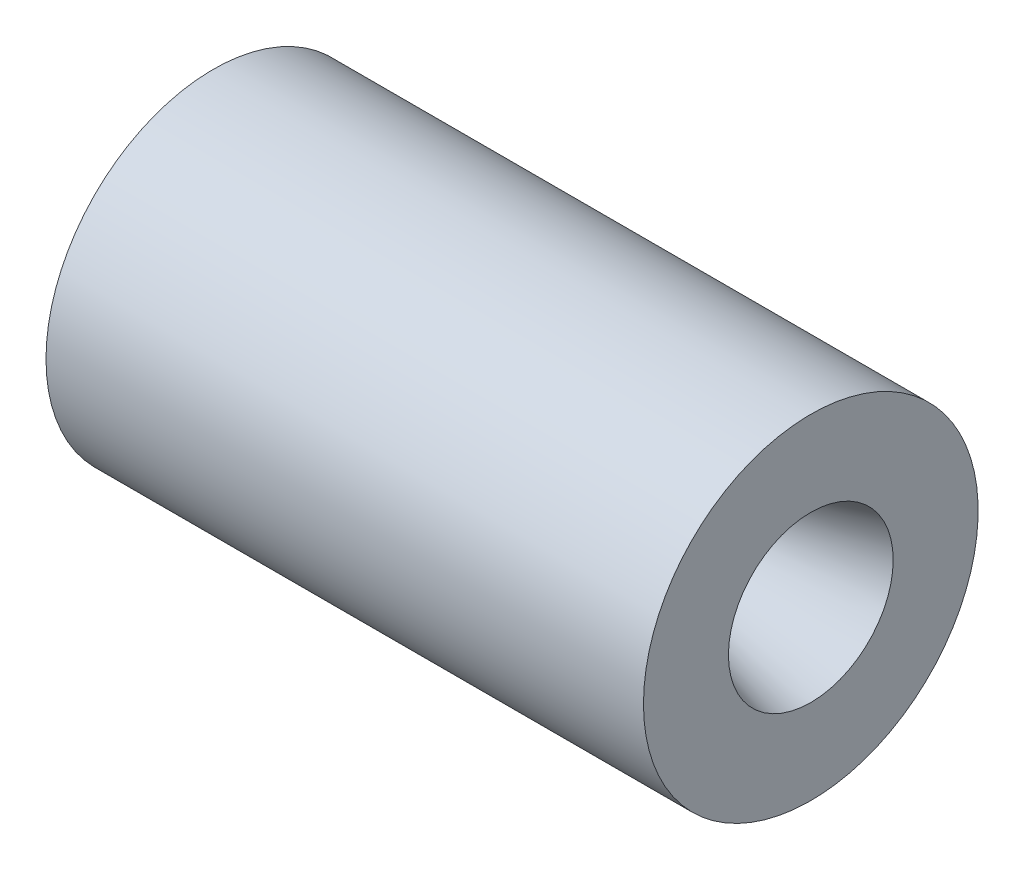
ISO-10303-21;
HEADER;
FILE_DESCRIPTION(('STEP AP214'),'2;1');
FILE_NAME('part.step','',(''),(''),'','','');
FILE_SCHEMA(('AUTOMOTIVE_DESIGN { 1 0 10303 214 1 1 1 1 }'));
ENDSEC;
DATA;
#1=APPLICATION_CONTEXT('core data for automotive mechanical design processes');
#2=APPLICATION_PROTOCOL_DEFINITION('international standard','automotive_design',2000,#1);
#3=PRODUCT_CONTEXT('',#1,'mechanical');
#4=PRODUCT('Part','Part','',(#3));
#5=PRODUCT_RELATED_PRODUCT_CATEGORY('part','',(#4));
#6=PRODUCT_DEFINITION_FORMATION('','',#4);
#7=PRODUCT_DEFINITION_CONTEXT('part definition',#1,'design');
#8=PRODUCT_DEFINITION('design','',#6,#7);
#9=PRODUCT_DEFINITION_SHAPE('','',#8);
#10=(LENGTH_UNIT() NAMED_UNIT(*) SI_UNIT(.MILLI.,.METRE.));
#11=(NAMED_UNIT(*) PLANE_ANGLE_UNIT() SI_UNIT($,.RADIAN.));
#12=(NAMED_UNIT(*) SI_UNIT($,.STERADIAN.) SOLID_ANGLE_UNIT());
#13=UNCERTAINTY_MEASURE_WITH_UNIT(LENGTH_MEASURE(1.E-05),#10,'distance_accuracy_value','');
#14=(GEOMETRIC_REPRESENTATION_CONTEXT(3) GLOBAL_UNCERTAINTY_ASSIGNED_CONTEXT((#13)) GLOBAL_UNIT_ASSIGNED_CONTEXT((#10,
#11,#12)) REPRESENTATION_CONTEXT('',''));
#15=CARTESIAN_POINT('',(0.,0.,0.));
#16=DIRECTION('',(0.,0.,1.));
#17=DIRECTION('',(1.,0.,0.));
#18=AXIS2_PLACEMENT_3D('',#15,#16,#17);
#19=CARTESIAN_POINT('',(117.474371320952,0.,0.));
#20=DIRECTION('',(-1.,0.,0.));
#21=DIRECTION('',(0.,0.,1.));
#22=AXIS2_PLACEMENT_3D('',#19,#20,#21);
#23=TOROIDAL_SURFACE('',#22,27.141418,20.431813);
#24=CARTESIAN_POINT('',(127.690278,0.,0.));
#25=DIRECTION('',(-1.,0.,0.));
#26=DIRECTION('',(0.,0.,1.));
#27=AXIS2_PLACEMENT_3D('',#24,#25,#26);
#28=CIRCLE('',#27,44.835887);
#29=CARTESIAN_POINT('',(127.690278,0.,44.835887));
#30=VERTEX_POINT('',#29);
#31=EDGE_CURVE('E10',#30,#30,#28,.T.);
#32=ORIENTED_EDGE('',*,*,#31,.F.);
#33=EDGE_LOOP('',(#32));
#34=FACE_BOUND('',#33,.T.);
#35=CARTESIAN_POINT('',(117.474371,0.,0.));
#36=DIRECTION('',(-1.,0.,0.));
#37=DIRECTION('',(0.,0.,1.));
#38=AXIS2_PLACEMENT_3D('',#35,#36,#37);
#39=CIRCLE('',#38,47.573231);
#40=CARTESIAN_POINT('',(117.474371,0.,47.573231));
#41=VERTEX_POINT('',#40);
#42=EDGE_CURVE('E62',#41,#41,#39,.T.);
#43=ORIENTED_EDGE('',*,*,#42,.T.);
#44=EDGE_LOOP('',(#43));
#45=FACE_BOUND('',#44,.T.);
#46=ADVANCED_FACE('F31',(#34,#45),#23,.F.);
#47=CARTESIAN_POINT('',(127.690278,0.,0.));
#48=DIRECTION('',(-1.,0.,0.));
#49=DIRECTION('',(0.,0.,1.));
#50=AXIS2_PLACEMENT_3D('',#47,#48,#49);
#51=CONICAL_SURFACE('',#50,44.835887,0.523598775598299);
#52=CARTESIAN_POINT('',(170.361247243036,0.,0.));
#53=DIRECTION('',(-1.,0.,0.));
#54=DIRECTION('',(0.,0.,1.));
#55=AXIS2_PLACEMENT_3D('',#52,#53,#54);
#56=CIRCLE('',#55,20.1997914209509);
#57=CARTESIAN_POINT('',(170.361247243036,0.,20.1997914209509));
#58=VERTEX_POINT('',#57);
#59=EDGE_CURVE('E37',#58,#58,#56,.T.);
#60=ORIENTED_EDGE('',*,*,#59,.F.);
#61=EDGE_LOOP('',(#60));
#62=FACE_BOUND('',#61,.T.);
#63=ORIENTED_EDGE('',*,*,#31,.T.);
#64=EDGE_LOOP('',(#63));
#65=FACE_BOUND('',#64,.T.);
#66=ADVANCED_FACE('F105',(#62,#65),#51,.F.);
#67=CARTESIAN_POINT('',(182.97600459609,0.,0.));
#68=DIRECTION('',(-1.,0.,0.));
#69=DIRECTION('',(0.,0.,1.));
#70=AXIS2_PLACEMENT_3D('',#67,#68,#69);
#71=TOROIDAL_SURFACE('',#70,42.0491924209509,25.229515);
#72=CARTESIAN_POINT('',(182.976005243036,0.,0.));
#73=DIRECTION('',(-1.,0.,0.));
#74=DIRECTION('',(0.,0.,1.));
#75=AXIS2_PLACEMENT_3D('',#72,#73,#74);
#76=CIRCLE('',#75,16.8196774209509);
#77=CARTESIAN_POINT('',(182.976005243036,0.,16.8196774209509));
#78=VERTEX_POINT('',#77);
#79=EDGE_CURVE('E41',#78,#78,#76,.T.);
#80=ORIENTED_EDGE('',*,*,#79,.F.);
#81=EDGE_LOOP('',(#80));
#82=FACE_BOUND('',#81,.T.);
#83=ORIENTED_EDGE('',*,*,#59,.T.);
#84=EDGE_LOOP('',(#83));
#85=FACE_BOUND('',#84,.T.);
#86=ADVANCED_FACE('F100',(#82,#85),#71,.T.);
#87=CARTESIAN_POINT('',(182.976006659395,0.,0.));
#88=DIRECTION('',(-1.,0.,0.));
#89=DIRECTION('',(0.,0.,1.));
#90=AXIS2_PLACEMENT_3D('',#87,#88,#89);
#91=TOROIDAL_SURFACE('',#90,23.2447944209507,6.425117);
#92=CARTESIAN_POINT('',(184.638947243036,0.,0.));
#93=DIRECTION('',(-1.,0.,0.));
#94=DIRECTION('',(0.,0.,1.));
#95=AXIS2_PLACEMENT_3D('',#92,#93,#94);
#96=CIRCLE('',#95,17.0386074209509);
#97=CARTESIAN_POINT('',(184.638947243036,0.,17.0386074209509));
#98=VERTEX_POINT('',#97);
#99=EDGE_CURVE('E45',#98,#98,#96,.T.);
#100=ORIENTED_EDGE('',*,*,#99,.F.);
#101=EDGE_LOOP('',(#100));
#102=FACE_BOUND('',#101,.T.);
#103=ORIENTED_EDGE('',*,*,#79,.T.);
#104=EDGE_LOOP('',(#103));
#105=FACE_BOUND('',#104,.T.);
#106=ADVANCED_FACE('F94',(#102,#105),#91,.T.);
#107=CARTESIAN_POINT('',(184.638947243036,0.,0.));
#108=DIRECTION('',(1.,0.,0.));
#109=DIRECTION('',(0.,0.,-1.));
#110=AXIS2_PLACEMENT_3D('',#107,#108,#109);
#111=CONICAL_SURFACE('',#110,17.0386074209509,0.261799389464667);
#112=CARTESIAN_POINT('',(249.383859243036,0.,0.));
#113=DIRECTION('',(-1.,0.,0.));
#114=DIRECTION('',(0.,0.,1.));
#115=AXIS2_PLACEMENT_3D('',#112,#113,#114);
#116=CIRCLE('',#115,34.3869544209509);
#117=CARTESIAN_POINT('',(249.383859243036,0.,34.3869544209509));
#118=VERTEX_POINT('',#117);
#119=EDGE_CURVE('E50',#118,#118,#116,.T.);
#120=ORIENTED_EDGE('',*,*,#119,.F.);
#121=EDGE_LOOP('',(#120));
#122=FACE_BOUND('',#121,.T.);
#123=ORIENTED_EDGE('',*,*,#99,.T.);
#124=EDGE_LOOP('',(#123));
#125=FACE_BOUND('',#124,.T.);
#126=ADVANCED_FACE('F88',(#122,#125),#111,.F.);
#127=CARTESIAN_POINT('',(249.383859243036,69.85,0.));
#128=DIRECTION('',(-1.,0.,0.));
#129=DIRECTION('',(0.,0.,1.));
#130=AXIS2_PLACEMENT_3D('',#127,#128,#129);
#131=PLANE('',#130);
#132=CARTESIAN_POINT('',(249.383859243036,0.,0.));
#133=DIRECTION('',(-1.,0.,0.));
#134=DIRECTION('',(0.,0.,1.));
#135=AXIS2_PLACEMENT_3D('',#132,#133,#134);
#136=CIRCLE('',#135,69.85);
#137=CARTESIAN_POINT('',(249.383859243036,0.,69.85));
#138=VERTEX_POINT('',#137);
#139=EDGE_CURVE('E53',#138,#138,#136,.T.);
#140=ORIENTED_EDGE('',*,*,#139,.F.);
#141=EDGE_LOOP('',(#140));
#142=FACE_BOUND('',#141,.T.);
#143=ORIENTED_EDGE('',*,*,#119,.T.);
#144=EDGE_LOOP('',(#143));
#145=FACE_BOUND('',#144,.T.);
#146=ADVANCED_FACE('F82',(#142,#145),#131,.F.);
#147=CARTESIAN_POINT('',(0.,0.,0.));
#148=DIRECTION('',(-1.,0.,0.));
#149=DIRECTION('',(0.,0.,1.));
#150=AXIS2_PLACEMENT_3D('',#147,#148,#149);
#151=CYLINDRICAL_SURFACE('',#150,69.85);
#152=CARTESIAN_POINT('',(0.,0.,0.));
#153=DIRECTION('',(-1.,0.,0.));
#154=DIRECTION('',(0.,0.,1.));
#155=AXIS2_PLACEMENT_3D('',#152,#153,#154);
#156=CIRCLE('',#155,69.85);
#157=CARTESIAN_POINT('',(0.,0.,69.85));
#158=VERTEX_POINT('',#157);
#159=EDGE_CURVE('E56',#158,#158,#156,.T.);
#160=ORIENTED_EDGE('',*,*,#159,.F.);
#161=EDGE_LOOP('',(#160));
#162=FACE_BOUND('',#161,.T.);
#163=ORIENTED_EDGE('',*,*,#139,.T.);
#164=EDGE_LOOP('',(#163));
#165=FACE_BOUND('',#164,.T.);
#166=ADVANCED_FACE('F76',(#162,#165),#151,.T.);
#167=CARTESIAN_POINT('',(0.,47.573231,0.));
#168=DIRECTION('',(1.,0.,0.));
#169=DIRECTION('',(0.,0.,-1.));
#170=AXIS2_PLACEMENT_3D('',#167,#168,#169);
#171=PLANE('',#170);
#172=CARTESIAN_POINT('',(0.,0.,0.));
#173=DIRECTION('',(-1.,0.,0.));
#174=DIRECTION('',(0.,0.,1.));
#175=AXIS2_PLACEMENT_3D('',#172,#173,#174);
#176=CIRCLE('',#175,47.573231);
#177=CARTESIAN_POINT('',(0.,0.,47.573231));
#178=VERTEX_POINT('',#177);
#179=EDGE_CURVE('E59',#178,#178,#176,.T.);
#180=ORIENTED_EDGE('',*,*,#179,.F.);
#181=EDGE_LOOP('',(#180));
#182=FACE_BOUND('',#181,.T.);
#183=ORIENTED_EDGE('',*,*,#159,.T.);
#184=EDGE_LOOP('',(#183));
#185=FACE_BOUND('',#184,.T.);
#186=ADVANCED_FACE('F70',(#182,#185),#171,.F.);
#187=CARTESIAN_POINT('',(0.,0.,0.));
#188=DIRECTION('',(-1.,0.,0.));
#189=DIRECTION('',(0.,0.,1.));
#190=AXIS2_PLACEMENT_3D('',#187,#188,#189);
#191=CYLINDRICAL_SURFACE('',#190,47.573231);
#192=ORIENTED_EDGE('',*,*,#42,.F.);
#193=EDGE_LOOP('',(#192));
#194=FACE_BOUND('',#193,.T.);
#195=ORIENTED_EDGE('',*,*,#179,.T.);
#196=EDGE_LOOP('',(#195));
#197=FACE_BOUND('',#196,.T.);
#198=ADVANCED_FACE('F67',(#194,#197),#191,.F.);
#199=CLOSED_SHELL('',(#46,#66,#86,#106,#126,#146,#166,#186,#198));
#200=MANIFOLD_SOLID_BREP('B2',#199);
#201=ADVANCED_BREP_SHAPE_REPRESENTATION('',(#18,#200),#14);
#202=SHAPE_DEFINITION_REPRESENTATION(#9,#201);
ENDSEC;
END-ISO-10303-21;
